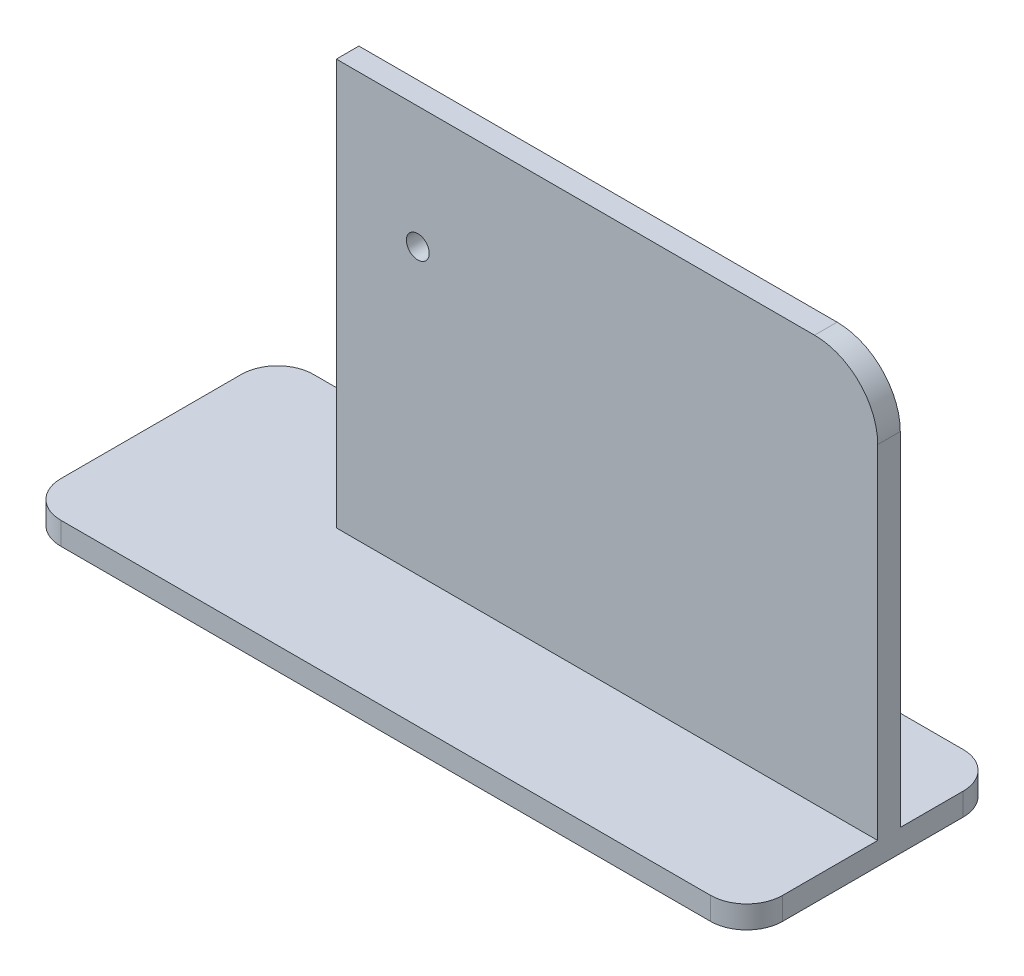
ISO-10303-21;
HEADER;
FILE_DESCRIPTION(('STEP AP214'),'2;1');
FILE_NAME('part.step','',(''),(''),'','','');
FILE_SCHEMA(('AUTOMOTIVE_DESIGN { 1 0 10303 214 1 1 1 1 }'));
ENDSEC;
DATA;
#1=APPLICATION_CONTEXT('core data for automotive mechanical design processes');
#2=APPLICATION_PROTOCOL_DEFINITION('international standard','automotive_design',2000,#1);
#3=PRODUCT_CONTEXT('',#1,'mechanical');
#4=PRODUCT('Part','Part','',(#3));
#5=PRODUCT_RELATED_PRODUCT_CATEGORY('part','',(#4));
#6=PRODUCT_DEFINITION_FORMATION('','',#4);
#7=PRODUCT_DEFINITION_CONTEXT('part definition',#1,'design');
#8=PRODUCT_DEFINITION('design','',#6,#7);
#9=PRODUCT_DEFINITION_SHAPE('','',#8);
#10=(LENGTH_UNIT() NAMED_UNIT(*) SI_UNIT(.MILLI.,.METRE.));
#11=(NAMED_UNIT(*) PLANE_ANGLE_UNIT() SI_UNIT($,.RADIAN.));
#12=(NAMED_UNIT(*) SI_UNIT($,.STERADIAN.) SOLID_ANGLE_UNIT());
#13=UNCERTAINTY_MEASURE_WITH_UNIT(LENGTH_MEASURE(1.E-05),#10,'distance_accuracy_value','');
#14=(GEOMETRIC_REPRESENTATION_CONTEXT(3) GLOBAL_UNCERTAINTY_ASSIGNED_CONTEXT((#13)) GLOBAL_UNIT_ASSIGNED_CONTEXT((#10,
#11,#12)) REPRESENTATION_CONTEXT('',''));
#15=CARTESIAN_POINT('',(0.,0.,0.));
#16=DIRECTION('',(0.,0.,1.));
#17=DIRECTION('',(1.,0.,0.));
#18=AXIS2_PLACEMENT_3D('',#15,#16,#17);
#19=CARTESIAN_POINT('',(23.4069122176234,22.8631990109478,2.5));
#20=DIRECTION('',(0.,0.,1.));
#21=DIRECTION('',(1.,0.,0.));
#22=AXIS2_PLACEMENT_3D('',#19,#20,#21);
#23=PLANE('',#22);
#24=DIRECTION('',(1.,0.,0.));
#25=VECTOR('',#24,1.);
#26=CARTESIAN_POINT('',(-29.5930877823766,-15.1368009890522,2.5));
#27=LINE('',#26,#25);
#28=CARTESIAN_POINT('',(-29.5930877823766,-15.1368009890522,2.5));
#29=VERTEX_POINT('',#28);
#30=CARTESIAN_POINT('',(30.4069122176234,-15.1368009890522,2.5));
#31=VERTEX_POINT('',#30);
#32=EDGE_CURVE('E135',#29,#31,#27,.T.);
#33=ORIENTED_EDGE('',*,*,#32,.T.);
#34=DIRECTION('',(0.,1.,0.));
#35=VECTOR('',#34,1.);
#36=CARTESIAN_POINT('',(30.4069122176234,-15.1368009890522,2.5));
#37=LINE('',#36,#35);
#38=CARTESIAN_POINT('',(30.4069122176234,22.8631990109477,2.5));
#39=VERTEX_POINT('',#38);
#40=EDGE_CURVE('E96',#31,#39,#37,.T.);
#41=ORIENTED_EDGE('',*,*,#40,.T.);
#42=CARTESIAN_POINT('',(23.4069122176234,22.8631990109478,2.5));
#43=DIRECTION('',(0.,0.,1.));
#44=DIRECTION('',(1.,0.,0.));
#45=AXIS2_PLACEMENT_3D('',#42,#43,#44);
#46=CIRCLE('',#45,7.);
#47=CARTESIAN_POINT('',(23.4069122176234,29.8631990109478,2.5));
#48=VERTEX_POINT('',#47);
#49=EDGE_CURVE('E102',#39,#48,#46,.T.);
#50=ORIENTED_EDGE('',*,*,#49,.T.);
#51=DIRECTION('',(-1.,0.,0.));
#52=VECTOR('',#51,1.);
#53=CARTESIAN_POINT('',(23.4069122176234,29.8631990109478,2.5));
#54=LINE('',#53,#52);
#55=CARTESIAN_POINT('',(-29.5930877823766,29.8631990109478,2.5));
#56=VERTEX_POINT('',#55);
#57=EDGE_CURVE('E105',#48,#56,#54,.T.);
#58=ORIENTED_EDGE('',*,*,#57,.T.);
#59=DIRECTION('',(0.,-1.,0.));
#60=VECTOR('',#59,1.);
#61=CARTESIAN_POINT('',(-29.5930877823766,29.8631990109478,2.5));
#62=LINE('',#61,#60);
#63=EDGE_CURVE('E63',#56,#29,#62,.T.);
#64=ORIENTED_EDGE('',*,*,#63,.T.);
#65=EDGE_LOOP('',(#33,#41,#50,#58,#64));
#66=FACE_BOUND('',#65,.T.);
#67=CARTESIAN_POINT('',(-20.5642985190458,16.3631990109478,2.5));
#68=DIRECTION('',(0.,0.,1.));
#69=DIRECTION('',(1.,0.,0.));
#70=AXIS2_PLACEMENT_3D('',#67,#68,#69);
#71=CIRCLE('',#70,1.2679221833019);
#72=CARTESIAN_POINT('',(-19.2963763357439,16.3631990109478,2.5));
#73=VERTEX_POINT('',#72);
#74=EDGE_CURVE('E124',#73,#73,#71,.T.);
#75=ORIENTED_EDGE('',*,*,#74,.F.);
#76=EDGE_LOOP('',(#75));
#77=FACE_BOUND('',#76,.T.);
#78=ADVANCED_FACE('F45',(#66,#77),#23,.T.);
#79=CARTESIAN_POINT('',(23.4069122176234,22.8631990109478,0.));
#80=DIRECTION('',(0.,0.,1.));
#81=DIRECTION('',(1.,0.,0.));
#82=AXIS2_PLACEMENT_3D('',#79,#80,#81);
#83=PLANE('',#82);
#84=DIRECTION('',(1.,0.,0.));
#85=VECTOR('',#84,1.);
#86=CARTESIAN_POINT('',(-29.5930877823766,-15.1368009890522,0.));
#87=LINE('',#86,#85);
#88=CARTESIAN_POINT('',(-29.5930877823766,-15.1368009890522,0.));
#89=VERTEX_POINT('',#88);
#90=CARTESIAN_POINT('',(30.4069122176234,-15.1368009890522,0.));
#91=VERTEX_POINT('',#90);
#92=EDGE_CURVE('E119',#89,#91,#87,.T.);
#93=ORIENTED_EDGE('',*,*,#92,.F.);
#94=DIRECTION('',(0.,-1.,0.));
#95=VECTOR('',#94,1.);
#96=CARTESIAN_POINT('',(-29.5930877823766,29.8631990109478,0.));
#97=LINE('',#96,#95);
#98=CARTESIAN_POINT('',(-29.5930877823766,29.8631990109478,0.));
#99=VERTEX_POINT('',#98);
#100=EDGE_CURVE('E131',#99,#89,#97,.T.);
#101=ORIENTED_EDGE('',*,*,#100,.F.);
#102=DIRECTION('',(-1.,0.,0.));
#103=VECTOR('',#102,1.);
#104=CARTESIAN_POINT('',(23.4069122176234,29.8631990109478,0.));
#105=LINE('',#104,#103);
#106=CARTESIAN_POINT('',(23.4069122176234,29.8631990109478,0.));
#107=VERTEX_POINT('',#106);
#108=EDGE_CURVE('E87',#107,#99,#105,.T.);
#109=ORIENTED_EDGE('',*,*,#108,.F.);
#110=CARTESIAN_POINT('',(23.4069122176234,22.8631990109478,0.));
#111=DIRECTION('',(0.,0.,1.));
#112=DIRECTION('',(1.,0.,0.));
#113=AXIS2_PLACEMENT_3D('',#110,#111,#112);
#114=CIRCLE('',#113,7.);
#115=CARTESIAN_POINT('',(30.4069122176234,22.8631990109477,0.));
#116=VERTEX_POINT('',#115);
#117=EDGE_CURVE('E80',#116,#107,#114,.T.);
#118=ORIENTED_EDGE('',*,*,#117,.F.);
#119=DIRECTION('',(0.,1.,0.));
#120=VECTOR('',#119,1.);
#121=CARTESIAN_POINT('',(30.4069122176234,-15.1368009890522,0.));
#122=LINE('',#121,#120);
#123=EDGE_CURVE('E123',#91,#116,#122,.T.);
#124=ORIENTED_EDGE('',*,*,#123,.F.);
#125=EDGE_LOOP('',(#93,#101,#109,#118,#124));
#126=FACE_BOUND('',#125,.T.);
#127=CARTESIAN_POINT('',(-20.5642985190458,16.3631990109478,0.));
#128=DIRECTION('',(0.,0.,1.));
#129=DIRECTION('',(1.,0.,0.));
#130=AXIS2_PLACEMENT_3D('',#127,#128,#129);
#131=CIRCLE('',#130,1.2679221833019);
#132=CARTESIAN_POINT('',(-19.2963763357439,16.3631990109478,0.));
#133=VERTEX_POINT('',#132);
#134=EDGE_CURVE('E204',#133,#133,#131,.T.);
#135=ORIENTED_EDGE('',*,*,#134,.T.);
#136=EDGE_LOOP('',(#135));
#137=FACE_BOUND('',#136,.T.);
#138=ADVANCED_FACE('F145',(#126,#137),#83,.F.);
#139=CARTESIAN_POINT('',(30.4069122176234,-15.1368009890522,2.5));
#140=DIRECTION('',(-1.,0.,0.));
#141=DIRECTION('',(0.,0.,1.));
#142=AXIS2_PLACEMENT_3D('',#139,#140,#141);
#143=PLANE('',#142);
#144=ORIENTED_EDGE('',*,*,#123,.T.);
#145=DIRECTION('',(0.,0.,-1.));
#146=VECTOR('',#145,1.);
#147=CARTESIAN_POINT('',(30.4069122176234,22.8631990109477,2.5));
#148=LINE('',#147,#146);
#149=EDGE_CURVE('E11',#39,#116,#148,.T.);
#150=ORIENTED_EDGE('',*,*,#149,.F.);
#151=ORIENTED_EDGE('',*,*,#40,.F.);
#152=DIRECTION('',(0.,0.,1.));
#153=VECTOR('',#152,1.);
#154=CARTESIAN_POINT('',(30.4069122176234,-15.1368009890522,13.0314669784363));
#155=LINE('',#154,#153);
#156=CARTESIAN_POINT('',(30.4069122176234,-15.1368009890522,13.0314669784363));
#157=VERTEX_POINT('',#156);
#158=EDGE_CURVE('E162',#31,#157,#155,.T.);
#159=ORIENTED_EDGE('',*,*,#158,.T.);
#160=DIRECTION('',(0.,1.,0.));
#161=VECTOR('',#160,1.);
#162=CARTESIAN_POINT('',(30.4069122176234,-17.6368009890522,13.0314669784363));
#163=LINE('',#162,#161);
#164=CARTESIAN_POINT('',(30.4069122176234,-17.6368009890522,13.0314669784363));
#165=VERTEX_POINT('',#164);
#166=EDGE_CURVE('E173',#165,#157,#163,.T.);
#167=ORIENTED_EDGE('',*,*,#166,.F.);
#168=DIRECTION('',(0.,0.,1.));
#169=VECTOR('',#168,1.);
#170=CARTESIAN_POINT('',(30.4069122176234,-17.6368009890522,13.0314669784363));
#171=LINE('',#170,#169);
#172=CARTESIAN_POINT('',(30.4069122176234,-17.6368009890522,-6.96853302156362));
#173=VERTEX_POINT('',#172);
#174=EDGE_CURVE('E177',#173,#165,#171,.T.);
#175=ORIENTED_EDGE('',*,*,#174,.F.);
#176=DIRECTION('',(0.,1.,0.));
#177=VECTOR('',#176,1.);
#178=CARTESIAN_POINT('',(30.4069122176234,-17.6368009890522,-6.96853302156362));
#179=LINE('',#178,#177);
#180=CARTESIAN_POINT('',(30.4069122176234,-15.1368009890522,-6.96853302156362));
#181=VERTEX_POINT('',#180);
#182=EDGE_CURVE('E159',#173,#181,#179,.T.);
#183=ORIENTED_EDGE('',*,*,#182,.T.);
#184=EDGE_CURVE('E154',#181,#91,#155,.T.);
#185=ORIENTED_EDGE('',*,*,#184,.T.);
#186=EDGE_LOOP('',(#144,#150,#151,#159,#167,#175,#183,#185));
#187=FACE_BOUND('',#186,.T.);
#188=ADVANCED_FACE('F47',(#187),#143,.F.);
#189=CARTESIAN_POINT('',(23.4069122176234,22.8631990109478,2.5));
#190=DIRECTION('',(0.,0.,-1.));
#191=DIRECTION('',(-1.,0.,0.));
#192=AXIS2_PLACEMENT_3D('',#189,#190,#191);
#193=CYLINDRICAL_SURFACE('',#192,7.);
#194=ORIENTED_EDGE('',*,*,#117,.T.);
#195=DIRECTION('',(0.,0.,-1.));
#196=VECTOR('',#195,1.);
#197=CARTESIAN_POINT('',(23.4069122176234,29.8631990109478,2.5));
#198=LINE('',#197,#196);
#199=EDGE_CURVE('E55',#48,#107,#198,.T.);
#200=ORIENTED_EDGE('',*,*,#199,.F.);
#201=ORIENTED_EDGE('',*,*,#49,.F.);
#202=ORIENTED_EDGE('',*,*,#149,.T.);
#203=EDGE_LOOP('',(#194,#200,#201,#202));
#204=FACE_BOUND('',#203,.T.);
#205=ADVANCED_FACE('F108',(#204),#193,.T.);
#206=CARTESIAN_POINT('',(23.4069122176234,29.8631990109478,2.5));
#207=DIRECTION('',(0.,-1.,0.));
#208=DIRECTION('',(1.,0.,0.));
#209=AXIS2_PLACEMENT_3D('',#206,#207,#208);
#210=PLANE('',#209);
#211=ORIENTED_EDGE('',*,*,#108,.T.);
#212=DIRECTION('',(0.,0.,-1.));
#213=VECTOR('',#212,1.);
#214=CARTESIAN_POINT('',(-29.5930877823766,29.8631990109478,2.5));
#215=LINE('',#214,#213);
#216=EDGE_CURVE('E110',#56,#99,#215,.T.);
#217=ORIENTED_EDGE('',*,*,#216,.F.);
#218=ORIENTED_EDGE('',*,*,#57,.F.);
#219=ORIENTED_EDGE('',*,*,#199,.T.);
#220=EDGE_LOOP('',(#211,#217,#218,#219));
#221=FACE_BOUND('',#220,.T.);
#222=ADVANCED_FACE('F111',(#221),#210,.F.);
#223=CARTESIAN_POINT('',(-29.5930877823766,29.8631990109478,2.5));
#224=DIRECTION('',(1.,0.,0.));
#225=DIRECTION('',(0.,0.,-1.));
#226=AXIS2_PLACEMENT_3D('',#223,#224,#225);
#227=PLANE('',#226);
#228=ORIENTED_EDGE('',*,*,#100,.T.);
#229=DIRECTION('',(0.,0.,-1.));
#230=VECTOR('',#229,1.);
#231=CARTESIAN_POINT('',(-29.5930877823766,-15.1368009890522,2.5));
#232=LINE('',#231,#230);
#233=EDGE_CURVE('E115',#29,#89,#232,.T.);
#234=ORIENTED_EDGE('',*,*,#233,.F.);
#235=ORIENTED_EDGE('',*,*,#63,.F.);
#236=ORIENTED_EDGE('',*,*,#216,.T.);
#237=EDGE_LOOP('',(#228,#234,#235,#236));
#238=FACE_BOUND('',#237,.T.);
#239=ADVANCED_FACE('F142',(#238),#227,.F.);
#240=CARTESIAN_POINT('',(-20.5642985190458,16.3631990109478,2.5));
#241=DIRECTION('',(0.,0.,-1.));
#242=DIRECTION('',(-1.,0.,0.));
#243=AXIS2_PLACEMENT_3D('',#240,#241,#242);
#244=CYLINDRICAL_SURFACE('',#243,1.2679221833019);
#245=ORIENTED_EDGE('',*,*,#74,.T.);
#246=EDGE_LOOP('',(#245));
#247=FACE_BOUND('',#246,.T.);
#248=ORIENTED_EDGE('',*,*,#134,.F.);
#249=EDGE_LOOP('',(#248));
#250=FACE_BOUND('',#249,.T.);
#251=ADVANCED_FACE('F330',(#247,#250),#244,.F.);
#252=CARTESIAN_POINT('',(26.4069122176234,-17.6368009890522,13.0314669784364));
#253=DIRECTION('',(0.,1.,0.));
#254=DIRECTION('',(0.,0.,1.));
#255=AXIS2_PLACEMENT_3D('',#252,#253,#254);
#256=CYLINDRICAL_SURFACE('',#255,4.);
#257=CARTESIAN_POINT('',(26.4069122176234,-15.1368009890522,13.0314669784364));
#258=DIRECTION('',(0.,-1.,0.));
#259=DIRECTION('',(0.,0.,1.));
#260=AXIS2_PLACEMENT_3D('',#257,#258,#259);
#261=CIRCLE('',#260,4.);
#262=CARTESIAN_POINT('',(26.4069122176234,-15.1368009890522,17.0314669784364));
#263=VERTEX_POINT('',#262);
#264=EDGE_CURVE('E244',#157,#263,#261,.T.);
#265=ORIENTED_EDGE('',*,*,#264,.T.);
#266=DIRECTION('',(0.,1.,0.));
#267=VECTOR('',#266,1.);
#268=CARTESIAN_POINT('',(26.4069122176234,-17.6368009890522,17.0314669784364));
#269=LINE('',#268,#267);
#270=CARTESIAN_POINT('',(26.4069122176234,-17.6368009890522,17.0314669784364));
#271=VERTEX_POINT('',#270);
#272=EDGE_CURVE('E200',#271,#263,#269,.T.);
#273=ORIENTED_EDGE('',*,*,#272,.F.);
#274=CARTESIAN_POINT('',(26.4069122176234,-17.6368009890522,13.0314669784364));
#275=DIRECTION('',(0.,-1.,0.));
#276=DIRECTION('',(0.,0.,1.));
#277=AXIS2_PLACEMENT_3D('',#274,#275,#276);
#278=CIRCLE('',#277,4.);
#279=EDGE_CURVE('E161',#165,#271,#278,.T.);
#280=ORIENTED_EDGE('',*,*,#279,.F.);
#281=ORIENTED_EDGE('',*,*,#166,.T.);
#282=EDGE_LOOP('',(#265,#273,#280,#281));
#283=FACE_BOUND('',#282,.T.);
#284=ADVANCED_FACE('F328',(#283),#256,.T.);
#285=CARTESIAN_POINT('',(-45.5930877823766,-17.6368009890522,17.0314669784364));
#286=DIRECTION('',(0.,0.,-1.));
#287=DIRECTION('',(-1.,0.,0.));
#288=AXIS2_PLACEMENT_3D('',#285,#286,#287);
#289=PLANE('',#288);
#290=DIRECTION('',(-1.,0.,0.));
#291=VECTOR('',#290,1.);
#292=CARTESIAN_POINT('',(-45.5930877823766,-15.1368009890522,17.0314669784364));
#293=LINE('',#292,#291);
#294=CARTESIAN_POINT('',(-45.5930877823766,-15.1368009890522,17.0314669784364));
#295=VERTEX_POINT('',#294);
#296=EDGE_CURVE('E248',#263,#295,#293,.T.);
#297=ORIENTED_EDGE('',*,*,#296,.T.);
#298=DIRECTION('',(0.,1.,0.));
#299=VECTOR('',#298,1.);
#300=CARTESIAN_POINT('',(-45.5930877823766,-17.6368009890522,17.0314669784364));
#301=LINE('',#300,#299);
#302=CARTESIAN_POINT('',(-45.5930877823766,-17.6368009890522,17.0314669784364));
#303=VERTEX_POINT('',#302);
#304=EDGE_CURVE('E196',#303,#295,#301,.T.);
#305=ORIENTED_EDGE('',*,*,#304,.F.);
#306=DIRECTION('',(-1.,0.,0.));
#307=VECTOR('',#306,1.);
#308=CARTESIAN_POINT('',(-45.5930877823766,-17.6368009890522,17.0314669784364));
#309=LINE('',#308,#307);
#310=EDGE_CURVE('E167',#271,#303,#309,.T.);
#311=ORIENTED_EDGE('',*,*,#310,.F.);
#312=ORIENTED_EDGE('',*,*,#272,.T.);
#313=EDGE_LOOP('',(#297,#305,#311,#312));
#314=FACE_BOUND('',#313,.T.);
#315=ADVANCED_FACE('F325',(#314),#289,.F.);
#316=CARTESIAN_POINT('',(-45.5930877823766,-17.6368009890522,13.0314669784364));
#317=DIRECTION('',(0.,1.,0.));
#318=DIRECTION('',(0.,0.,1.));
#319=AXIS2_PLACEMENT_3D('',#316,#317,#318);
#320=CYLINDRICAL_SURFACE('',#319,4.);
#321=CARTESIAN_POINT('',(-45.5930877823766,-15.1368009890522,13.0314669784364));
#322=DIRECTION('',(0.,-1.,0.));
#323=DIRECTION('',(0.,0.,1.));
#324=AXIS2_PLACEMENT_3D('',#321,#322,#323);
#325=CIRCLE('',#324,4.);
#326=CARTESIAN_POINT('',(-49.5930877823766,-15.1368009890522,13.0314669784363));
#327=VERTEX_POINT('',#326);
#328=EDGE_CURVE('E252',#295,#327,#325,.T.);
#329=ORIENTED_EDGE('',*,*,#328,.T.);
#330=DIRECTION('',(0.,1.,0.));
#331=VECTOR('',#330,1.);
#332=CARTESIAN_POINT('',(-49.5930877823766,-17.6368009890522,13.0314669784363));
#333=LINE('',#332,#331);
#334=CARTESIAN_POINT('',(-49.5930877823766,-17.6368009890522,13.0314669784363));
#335=VERTEX_POINT('',#334);
#336=EDGE_CURVE('E192',#335,#327,#333,.T.);
#337=ORIENTED_EDGE('',*,*,#336,.F.);
#338=CARTESIAN_POINT('',(-45.5930877823766,-17.6368009890522,13.0314669784364));
#339=DIRECTION('',(0.,-1.,0.));
#340=DIRECTION('',(0.,0.,1.));
#341=AXIS2_PLACEMENT_3D('',#338,#339,#340);
#342=CIRCLE('',#341,4.);
#343=EDGE_CURVE('E232',#303,#335,#342,.T.);
#344=ORIENTED_EDGE('',*,*,#343,.F.);
#345=ORIENTED_EDGE('',*,*,#304,.T.);
#346=EDGE_LOOP('',(#329,#337,#344,#345));
#347=FACE_BOUND('',#346,.T.);
#348=ADVANCED_FACE('F322',(#347),#320,.T.);
#349=CARTESIAN_POINT('',(-49.5930877823766,-17.6368009890522,-6.96853302156363));
#350=DIRECTION('',(1.,0.,0.));
#351=DIRECTION('',(0.,0.,-1.));
#352=AXIS2_PLACEMENT_3D('',#349,#350,#351);
#353=PLANE('',#352);
#354=DIRECTION('',(0.,0.,-1.));
#355=VECTOR('',#354,1.);
#356=CARTESIAN_POINT('',(-49.5930877823766,-15.1368009890522,-6.96853302156363));
#357=LINE('',#356,#355);
#358=CARTESIAN_POINT('',(-49.5930877823766,-15.1368009890522,-6.96853302156363));
#359=VERTEX_POINT('',#358);
#360=EDGE_CURVE('E256',#327,#359,#357,.T.);
#361=ORIENTED_EDGE('',*,*,#360,.T.);
#362=DIRECTION('',(0.,1.,0.));
#363=VECTOR('',#362,1.);
#364=CARTESIAN_POINT('',(-49.5930877823766,-17.6368009890522,-6.96853302156363));
#365=LINE('',#364,#363);
#366=CARTESIAN_POINT('',(-49.5930877823766,-17.6368009890522,-6.96853302156363));
#367=VERTEX_POINT('',#366);
#368=EDGE_CURVE('E188',#367,#359,#365,.T.);
#369=ORIENTED_EDGE('',*,*,#368,.F.);
#370=DIRECTION('',(0.,0.,-1.));
#371=VECTOR('',#370,1.);
#372=CARTESIAN_POINT('',(-49.5930877823766,-17.6368009890522,-6.96853302156363));
#373=LINE('',#372,#371);
#374=EDGE_CURVE('E228',#335,#367,#373,.T.);
#375=ORIENTED_EDGE('',*,*,#374,.F.);
#376=ORIENTED_EDGE('',*,*,#336,.T.);
#377=EDGE_LOOP('',(#361,#369,#375,#376));
#378=FACE_BOUND('',#377,.T.);
#379=ADVANCED_FACE('F310',(#378),#353,.F.);
#380=CARTESIAN_POINT('',(-45.5930877823766,-17.6368009890522,-6.96853302156366));
#381=DIRECTION('',(0.,1.,0.));
#382=DIRECTION('',(0.,0.,1.));
#383=AXIS2_PLACEMENT_3D('',#380,#381,#382);
#384=CYLINDRICAL_SURFACE('',#383,4.);
#385=CARTESIAN_POINT('',(-45.5930877823766,-15.1368009890522,-6.96853302156366));
#386=DIRECTION('',(0.,-1.,0.));
#387=DIRECTION('',(0.,0.,1.));
#388=AXIS2_PLACEMENT_3D('',#385,#386,#387);
#389=CIRCLE('',#388,4.);
#390=CARTESIAN_POINT('',(-45.5930877823766,-15.1368009890522,-10.9685330215637));
#391=VERTEX_POINT('',#390);
#392=EDGE_CURVE('E260',#359,#391,#389,.T.);
#393=ORIENTED_EDGE('',*,*,#392,.T.);
#394=DIRECTION('',(0.,1.,0.));
#395=VECTOR('',#394,1.);
#396=CARTESIAN_POINT('',(-45.5930877823766,-17.6368009890522,-10.9685330215637));
#397=LINE('',#396,#395);
#398=CARTESIAN_POINT('',(-45.5930877823766,-17.6368009890522,-10.9685330215637));
#399=VERTEX_POINT('',#398);
#400=EDGE_CURVE('E184',#399,#391,#397,.T.);
#401=ORIENTED_EDGE('',*,*,#400,.F.);
#402=CARTESIAN_POINT('',(-45.5930877823766,-17.6368009890522,-6.96853302156366));
#403=DIRECTION('',(0.,-1.,0.));
#404=DIRECTION('',(0.,0.,1.));
#405=AXIS2_PLACEMENT_3D('',#402,#403,#404);
#406=CIRCLE('',#405,4.);
#407=EDGE_CURVE('E224',#367,#399,#406,.T.);
#408=ORIENTED_EDGE('',*,*,#407,.F.);
#409=ORIENTED_EDGE('',*,*,#368,.T.);
#410=EDGE_LOOP('',(#393,#401,#408,#409));
#411=FACE_BOUND('',#410,.T.);
#412=ADVANCED_FACE('F316',(#411),#384,.T.);
#413=CARTESIAN_POINT('',(26.4069122176234,-17.6368009890522,-10.9685330215636));
#414=DIRECTION('',(0.,0.,1.));
#415=DIRECTION('',(1.,0.,0.));
#416=AXIS2_PLACEMENT_3D('',#413,#414,#415);
#417=PLANE('',#416);
#418=DIRECTION('',(1.,0.,0.));
#419=VECTOR('',#418,1.);
#420=CARTESIAN_POINT('',(26.4069122176234,-15.1368009890522,-10.9685330215636));
#421=LINE('',#420,#419);
#422=CARTESIAN_POINT('',(26.4069122176234,-15.1368009890522,-10.9685330215636));
#423=VERTEX_POINT('',#422);
#424=EDGE_CURVE('E263',#391,#423,#421,.T.);
#425=ORIENTED_EDGE('',*,*,#424,.T.);
#426=DIRECTION('',(0.,1.,0.));
#427=VECTOR('',#426,1.);
#428=CARTESIAN_POINT('',(26.4069122176234,-17.6368009890522,-10.9685330215636));
#429=LINE('',#428,#427);
#430=CARTESIAN_POINT('',(26.4069122176234,-17.6368009890522,-10.9685330215636));
#431=VERTEX_POINT('',#430);
#432=EDGE_CURVE('E180',#431,#423,#429,.T.);
#433=ORIENTED_EDGE('',*,*,#432,.F.);
#434=DIRECTION('',(1.,0.,0.));
#435=VECTOR('',#434,1.);
#436=CARTESIAN_POINT('',(26.4069122176234,-17.6368009890522,-10.9685330215636));
#437=LINE('',#436,#435);
#438=EDGE_CURVE('E220',#399,#431,#437,.T.);
#439=ORIENTED_EDGE('',*,*,#438,.F.);
#440=ORIENTED_EDGE('',*,*,#400,.T.);
#441=EDGE_LOOP('',(#425,#433,#439,#440));
#442=FACE_BOUND('',#441,.T.);
#443=ADVANCED_FACE('F405',(#442),#417,.F.);
#444=CARTESIAN_POINT('',(26.4069122176234,-17.6368009890522,-6.96853302156365));
#445=DIRECTION('',(0.,1.,0.));
#446=DIRECTION('',(0.,0.,1.));
#447=AXIS2_PLACEMENT_3D('',#444,#445,#446);
#448=CYLINDRICAL_SURFACE('',#447,4.);
#449=CARTESIAN_POINT('',(26.4069122176234,-15.1368009890522,-6.96853302156365));
#450=DIRECTION('',(0.,-1.,0.));
#451=DIRECTION('',(0.,0.,1.));
#452=AXIS2_PLACEMENT_3D('',#449,#450,#451);
#453=CIRCLE('',#452,4.);
#454=EDGE_CURVE('E169',#423,#181,#453,.T.);
#455=ORIENTED_EDGE('',*,*,#454,.T.);
#456=ORIENTED_EDGE('',*,*,#182,.F.);
#457=CARTESIAN_POINT('',(26.4069122176234,-17.6368009890522,-6.96853302156365));
#458=DIRECTION('',(0.,-1.,0.));
#459=DIRECTION('',(0.,0.,1.));
#460=AXIS2_PLACEMENT_3D('',#457,#458,#459);
#461=CIRCLE('',#460,4.);
#462=EDGE_CURVE('E216',#431,#173,#461,.T.);
#463=ORIENTED_EDGE('',*,*,#462,.F.);
#464=ORIENTED_EDGE('',*,*,#432,.T.);
#465=EDGE_LOOP('',(#455,#456,#463,#464));
#466=FACE_BOUND('',#465,.T.);
#467=ADVANCED_FACE('F273',(#466),#448,.T.);
#468=CARTESIAN_POINT('',(26.4069122176234,-17.6368009890522,13.0314669784364));
#469=DIRECTION('',(0.,1.,0.));
#470=DIRECTION('',(0.,0.,1.));
#471=AXIS2_PLACEMENT_3D('',#468,#469,#470);
#472=PLANE('',#471);
#473=ORIENTED_EDGE('',*,*,#279,.T.);
#474=ORIENTED_EDGE('',*,*,#310,.T.);
#475=ORIENTED_EDGE('',*,*,#343,.T.);
#476=ORIENTED_EDGE('',*,*,#374,.T.);
#477=ORIENTED_EDGE('',*,*,#407,.T.);
#478=ORIENTED_EDGE('',*,*,#438,.T.);
#479=ORIENTED_EDGE('',*,*,#462,.T.);
#480=ORIENTED_EDGE('',*,*,#174,.T.);
#481=EDGE_LOOP('',(#473,#474,#475,#476,#477,#478,#479,#480));
#482=FACE_BOUND('',#481,.T.);
#483=ADVANCED_FACE('F319',(#482),#472,.F.);
#484=CARTESIAN_POINT('',(26.4069122176234,-15.1368009890522,13.0314669784364));
#485=DIRECTION('',(0.,1.,0.));
#486=DIRECTION('',(0.,0.,1.));
#487=AXIS2_PLACEMENT_3D('',#484,#485,#486);
#488=PLANE('',#487);
#489=ORIENTED_EDGE('',*,*,#233,.T.);
#490=ORIENTED_EDGE('',*,*,#92,.T.);
#491=ORIENTED_EDGE('',*,*,#184,.F.);
#492=ORIENTED_EDGE('',*,*,#454,.F.);
#493=ORIENTED_EDGE('',*,*,#424,.F.);
#494=ORIENTED_EDGE('',*,*,#392,.F.);
#495=ORIENTED_EDGE('',*,*,#360,.F.);
#496=ORIENTED_EDGE('',*,*,#328,.F.);
#497=ORIENTED_EDGE('',*,*,#296,.F.);
#498=ORIENTED_EDGE('',*,*,#264,.F.);
#499=ORIENTED_EDGE('',*,*,#158,.F.);
#500=ORIENTED_EDGE('',*,*,#32,.F.);
#501=EDGE_LOOP('',(#489,#490,#491,#492,#493,#494,#495,#496,#497,#498,#499,#500));
#502=FACE_BOUND('',#501,.T.);
#503=ADVANCED_FACE('F151',(#502),#488,.T.);
#504=CLOSED_SHELL('',(#78,#138,#188,#205,#222,#239,#251,#284,#315,#348,#379,#412,#443,#467,#483,#503));
#505=MANIFOLD_SOLID_BREP('B2',#504);
#506=ADVANCED_BREP_SHAPE_REPRESENTATION('',(#18,#505),#14);
#507=SHAPE_DEFINITION_REPRESENTATION(#9,#506);
ENDSEC;
END-ISO-10303-21;
